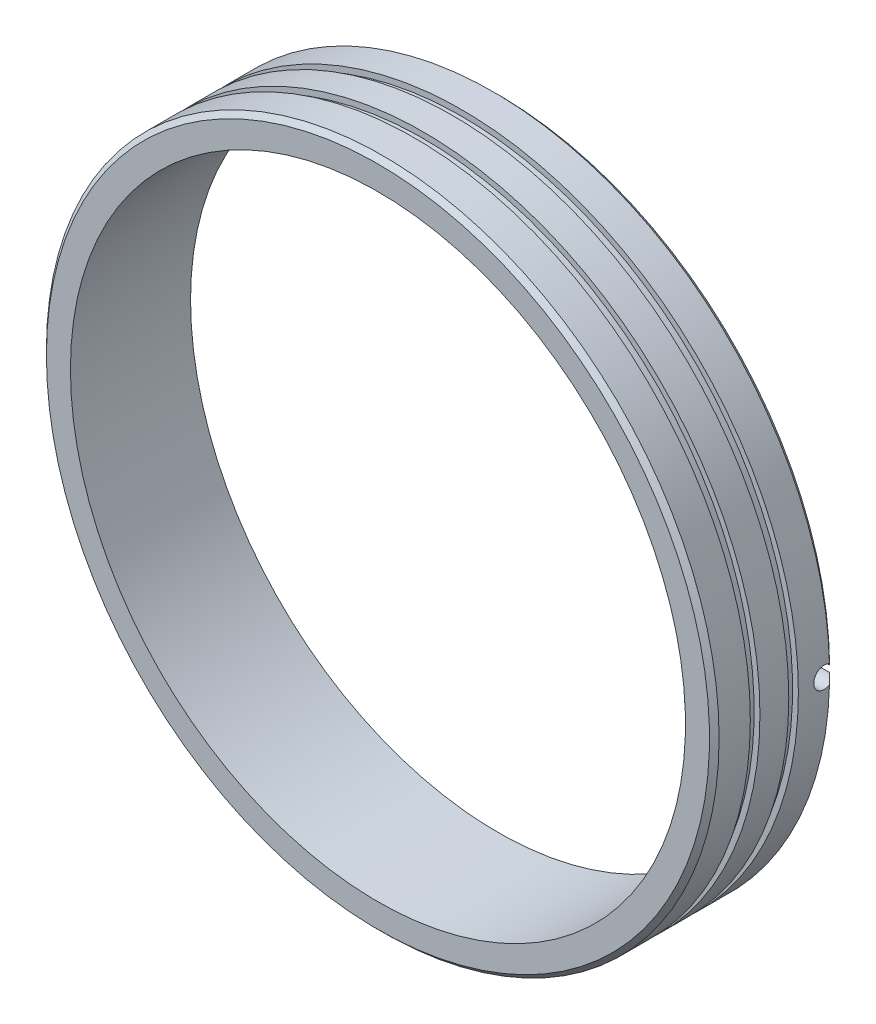
ISO-10303-21;
HEADER;
FILE_DESCRIPTION(('STEP AP214'),'2;1');
FILE_NAME('part.step','',(''),(''),'','','');
FILE_SCHEMA(('AUTOMOTIVE_DESIGN { 1 0 10303 214 1 1 1 1 }'));
ENDSEC;
DATA;
#1=APPLICATION_CONTEXT('core data for automotive mechanical design processes');
#2=APPLICATION_PROTOCOL_DEFINITION('international standard','automotive_design',2000,#1);
#3=PRODUCT_CONTEXT('',#1,'mechanical');
#4=PRODUCT('Part','Part','',(#3));
#5=PRODUCT_RELATED_PRODUCT_CATEGORY('part','',(#4));
#6=PRODUCT_DEFINITION_FORMATION('','',#4);
#7=PRODUCT_DEFINITION_CONTEXT('part definition',#1,'design');
#8=PRODUCT_DEFINITION('design','',#6,#7);
#9=PRODUCT_DEFINITION_SHAPE('','',#8);
#10=(LENGTH_UNIT() NAMED_UNIT(*) SI_UNIT(.MILLI.,.METRE.));
#11=(NAMED_UNIT(*) PLANE_ANGLE_UNIT() SI_UNIT($,.RADIAN.));
#12=(NAMED_UNIT(*) SI_UNIT($,.STERADIAN.) SOLID_ANGLE_UNIT());
#13=UNCERTAINTY_MEASURE_WITH_UNIT(LENGTH_MEASURE(1.E-05),#10,'distance_accuracy_value','');
#14=(GEOMETRIC_REPRESENTATION_CONTEXT(3) GLOBAL_UNCERTAINTY_ASSIGNED_CONTEXT((#13)) GLOBAL_UNIT_ASSIGNED_CONTEXT((#10,
#11,#12)) REPRESENTATION_CONTEXT('',''));
#15=CARTESIAN_POINT('',(0.,0.,0.));
#16=DIRECTION('',(0.,0.,1.));
#17=DIRECTION('',(1.,0.,0.));
#18=AXIS2_PLACEMENT_3D('',#15,#16,#17);
#19=CARTESIAN_POINT('',(0.,69.,1.5));
#20=DIRECTION('',(0.,0.,-1.));
#21=DIRECTION('',(-1.,0.,0.));
#22=AXIS2_PLACEMENT_3D('',#19,#20,#21);
#23=PLANE('',#22);
#24=CARTESIAN_POINT('',(0.,0.,1.5));
#25=DIRECTION('',(0.,0.,-1.));
#26=DIRECTION('',(-1.,0.,0.));
#27=AXIS2_PLACEMENT_3D('',#24,#25,#26);
#28=CIRCLE('',#27,64.);
#29=CARTESIAN_POINT('',(63.9966405368282,-0.6557438524302,1.5));
#30=VERTEX_POINT('',#29);
#31=CARTESIAN_POINT('',(63.9966405368282,0.6557438524302,1.5));
#32=VERTEX_POINT('',#31);
#33=EDGE_CURVE('E85',#30,#32,#28,.T.);
#34=ORIENTED_EDGE('',*,*,#33,.F.);
#35=DIRECTION('',(-1.,0.,0.));
#36=VECTOR('',#35,1.);
#37=CARTESIAN_POINT('',(71.,-0.6557438524302,1.5));
#38=LINE('',#37,#36);
#39=CARTESIAN_POINT('',(68.9968839876118,-0.655743852430738,1.49999999999975));
#40=VERTEX_POINT('',#39);
#41=EDGE_CURVE('E80',#30,#40,#38,.F.);
#42=ORIENTED_EDGE('',*,*,#41,.T.);
#43=CARTESIAN_POINT('',(0.,0.,1.5));
#44=DIRECTION('',(0.,0.,-1.));
#45=DIRECTION('',(-1.,0.,0.));
#46=AXIS2_PLACEMENT_3D('',#43,#44,#45);
#47=CIRCLE('',#46,69.);
#48=CARTESIAN_POINT('',(68.9968839876121,0.655743852430198,1.5));
#49=VERTEX_POINT('',#48);
#50=EDGE_CURVE('E88',#40,#49,#47,.T.);
#51=ORIENTED_EDGE('',*,*,#50,.T.);
#52=DIRECTION('',(-1.,0.,0.));
#53=VECTOR('',#52,1.);
#54=CARTESIAN_POINT('',(71.,0.6557438524302,1.5));
#55=LINE('',#54,#53);
#56=EDGE_CURVE('E93',#49,#32,#55,.T.);
#57=ORIENTED_EDGE('',*,*,#56,.T.);
#58=EDGE_LOOP('',(#34,#42,#51,#57));
#59=FACE_BOUND('',#58,.T.);
#60=ADVANCED_FACE('F39',(#59),#23,.T.);
#61=CARTESIAN_POINT('',(0.,0.,0.));
#62=DIRECTION('',(0.,0.,-1.));
#63=DIRECTION('',(-1.,0.,0.));
#64=AXIS2_PLACEMENT_3D('',#61,#62,#63);
#65=CYLINDRICAL_SURFACE('',#64,64.);
#66=CARTESIAN_POINT('',(0.,0.,26.5));
#67=DIRECTION('',(0.,0.,-1.));
#68=DIRECTION('',(-1.,0.,0.));
#69=AXIS2_PLACEMENT_3D('',#66,#67,#68);
#70=CIRCLE('',#69,64.);
#71=CARTESIAN_POINT('',(-64.,0.,26.5));
#72=VERTEX_POINT('',#71);
#73=EDGE_CURVE('E130',#72,#72,#70,.T.);
#74=ORIENTED_EDGE('',*,*,#73,.F.);
#75=EDGE_LOOP('',(#74));
#76=FACE_BOUND('',#75,.T.);
#77=ORIENTED_EDGE('',*,*,#33,.T.);
#78=CARTESIAN_POINT('',(63.9966405368282,0.6557438524302,1.5));
#79=CARTESIAN_POINT('',(63.9960355313497,0.714828654834886,1.51845018495424));
#80=CARTESIAN_POINT('',(63.9953560748767,0.773105499854566,1.53938567097289));
#81=CARTESIAN_POINT('',(63.9938691506616,0.887685326368586,1.58608689248524));
#82=CARTESIAN_POINT('',(63.9930616894037,0.943988407668942,1.61185238332384));
#83=CARTESIAN_POINT('',(63.9904812899459,1.10923205527596,1.69609632823883));
#84=CARTESIAN_POINT('',(63.9885482601087,1.21469890325343,1.76158238212781));
#85=CARTESIAN_POINT('',(63.9844742794105,1.41313330973744,1.90932454984776));
#86=CARTESIAN_POINT('',(63.9823332348744,1.5060951915261,1.99158823765328));
#87=CARTESIAN_POINT('',(63.9780849528549,1.67688727662046,2.17054695107996));
#88=CARTESIAN_POINT('',(63.9759777089866,1.75472036939317,2.26723921472038));
#89=CARTESIAN_POINT('',(63.9720338675274,1.8930643864804,2.47234082581569));
#90=CARTESIAN_POINT('',(63.9701973283563,1.95357157440688,2.58075269370823));
#91=CARTESIAN_POINT('',(63.9670023706672,2.05553470734067,2.8062203286565));
#92=CARTESIAN_POINT('',(63.9656440228184,2.09698783672947,2.92327737024526));
#93=CARTESIAN_POINT('',(63.9635596832414,2.15963513532369,3.16264863046549));
#94=CARTESIAN_POINT('',(63.9628334430369,2.18083726534706,3.28496076350595));
#95=CARTESIAN_POINT('',(63.9620944518421,2.20240618216054,3.53140284618538));
#96=CARTESIAN_POINT('',(63.9620816542719,2.20277432917951,3.65553267661949));
#97=CARTESIAN_POINT('',(63.9627707210345,2.18267259888069,3.90203583997396));
#98=CARTESIAN_POINT('',(63.9634722694707,2.16221193243951,4.02440992505853));
#99=CARTESIAN_POINT('',(63.9655104083833,2.10104867772378,4.26398750687467));
#100=CARTESIAN_POINT('',(63.9668470126341,2.06034565039322,4.38119089139392));
#101=CARTESIAN_POINT('',(63.9700047720249,1.95984780594549,4.60711684887966));
#102=CARTESIAN_POINT('',(63.9718259945064,1.90005033527691,4.71583824049048));
#103=CARTESIAN_POINT('',(63.9757476455198,1.76306304626749,4.92170157537921));
#104=CARTESIAN_POINT('',(63.9778480733861,1.68587326939073,5.01884354626214));
#105=CARTESIAN_POINT('',(63.9820927161592,1.51624370512112,5.1988454512589));
#106=CARTESIAN_POINT('',(63.9842369536498,1.42379586910501,5.28169780017573));
#107=CARTESIAN_POINT('',(63.9883264884012,1.22629961568631,5.43070791692029));
#108=CARTESIAN_POINT('',(63.990271785248,1.12125117206314,5.49686565000734));
#109=CARTESIAN_POINT('',(63.9937443448129,0.901522967033532,5.61061240908629));
#110=CARTESIAN_POINT('',(63.9952715720986,0.786842390356656,5.65819986134811));
#111=CARTESIAN_POINT('',(63.9977355606016,0.55111318843179,5.73344359548238));
#112=CARTESIAN_POINT('',(63.998672324006,0.43006458677256,5.76109995117902));
#113=CARTESIAN_POINT('',(63.9998494410775,0.185098775239764,5.79568487730061));
#114=CARTESIAN_POINT('',(64.0000901349399,0.0611829965229306,5.80262357327118));
#115=CARTESIAN_POINT('',(63.9998489554343,-0.186054372436356,5.7956041538341));
#116=CARTESIAN_POINT('',(63.9993670835317,-0.309375963883269,5.78164608080358));
#117=CARTESIAN_POINT('',(63.9977353359767,-0.551886021138484,5.73323836660406));
#118=CARTESIAN_POINT('',(63.9965856609167,-0.671075716684326,5.69879487870093));
#119=CARTESIAN_POINT('',(63.9937479288967,-0.901981043676224,5.61040120188278));
#120=CARTESIAN_POINT('',(63.992059870409,-1.01369665391055,5.55645095760965));
#121=CARTESIAN_POINT('',(63.9883347189916,-1.22652671762213,5.43055303599796));
#122=CARTESIAN_POINT('',(63.9862975015592,-1.32763736878587,5.35859893462987));
#123=CARTESIAN_POINT('',(63.9821038728376,-1.51634745727385,5.19874381062899));
#124=CARTESIAN_POINT('',(63.9799474613571,-1.6039468728909,5.11084276237627));
#125=CARTESIAN_POINT('',(63.9757573624067,-1.76318886416964,4.92154085064414));
#126=CARTESIAN_POINT('',(63.9737237312891,-1.83482415281145,4.82013385581476));
#127=CARTESIAN_POINT('',(63.9700096236547,-1.9600533441064,4.60672599235404));
#128=CARTESIAN_POINT('',(63.9683291486147,-2.01364717131596,4.49472507942486));
#129=CARTESIAN_POINT('',(63.9655112582438,-2.10126215317601,4.26332538560151));
#130=CARTESIAN_POINT('',(63.9643737614297,-2.13528624475072,4.14392771775465));
#131=CARTESIAN_POINT('',(63.9627699295431,-2.18280443175172,3.90111246443361));
#132=CARTESIAN_POINT('',(63.9623035810744,-2.19629893695256,3.77769495924639));
#133=CARTESIAN_POINT('',(63.9620947455558,-2.20237276809453,3.53041255926403));
#134=CARTESIAN_POINT('',(63.9623518685864,-2.19496336032387,3.40654794138193));
#135=CARTESIAN_POINT('',(63.9635601393379,-2.15946392368036,3.1618168566723));
#136=CARTESIAN_POINT('',(63.9645113155343,-2.1313730462846,3.04095051306881));
#137=CARTESIAN_POINT('',(63.9670003044048,-2.05531235373944,2.8056591658348));
#138=CARTESIAN_POINT('',(63.9685380797028,-2.00734380510944,2.69123375234352));
#139=CARTESIAN_POINT('',(63.9720268426248,-1.89289302862836,2.47206483583606));
#140=CARTESIAN_POINT('',(63.9739778050034,-1.82641193179862,2.36732074186168));
#141=CARTESIAN_POINT('',(63.9780742797743,-1.67678193587367,2.17041842692611));
#142=CARTESIAN_POINT('',(63.9802199058013,-1.59362326652538,2.07826763698152));
#143=CARTESIAN_POINT('',(63.984463354104,-1.41300912507469,1.90923152053194));
#144=CARTESIAN_POINT('',(63.9865611821814,-1.31555539891382,1.83234433248618));
#145=CARTESIAN_POINT('',(63.9901451122917,-1.12636121819089,1.70740054798216));
#146=CARTESIAN_POINT('',(63.9916749164999,-1.03636919697133,1.65667537890616));
#147=CARTESIAN_POINT('',(63.9944208792047,-0.850237007978545,1.56831305202433));
#148=CARTESIAN_POINT('',(63.9956372236896,-0.754100528419748,1.53066812854233));
#149=CARTESIAN_POINT('',(63.9966405368282,-0.6557438524302,1.5));
#150=B_SPLINE_CURVE_WITH_KNOTS('',3,(#78,#79,#80,#81,#82,#83,#84,#85,#86,#87,#88,#89,#90,#91,
#92,#93,#94,#95,#96,#97,#98,#99,#100,#101,#102,#103,#104,#105,#106,#107,#108,#109,#110,#111,
#112,#113,#114,#115,#116,#117,#118,#119,#120,#121,#122,#123,#124,#125,#126,#127,#128,#129,#130,
#131,#132,#133,#134,#135,#136,#137,#138,#139,#140,#141,#142,#143,#144,#145,#146,#147,#148,#149),
.UNSPECIFIED.,.F.,.F.,(4,2,2,2,2,2,2,2,2,2,2,2,2,2,2,2,2,2,2,2,2,2,2,2,2,2,2,2,2,2,2,2,2,2,2,4),
(0.,0.185590145572976,0.371170892953936,0.741736802217008,1.1124703688512,1.48313305887637,
1.85387562342532,2.22467295501,2.59532446335023,2.96595177221512,3.33641525417352,
3.70688677182065,4.07740979625187,4.44793193734843,4.81865015717222,5.18936914843607,
5.56011954929452,5.93086857689734,6.30143637499674,6.67200342161232,7.04245921606074,
7.41291606183155,7.78350528078906,8.15409509513027,8.5248537247815,8.89561390480639,
9.26631842854274,9.63701555284749,10.007512925905,10.3780255006401,10.7485144715425,
11.1189808124417,11.4896648216464,11.8603035946154,12.1692579587007,12.4780285834581),.UNSPECIFIED.);
#151=EDGE_CURVE('E66',#32,#30,#150,.T.);
#152=ORIENTED_EDGE('',*,*,#151,.T.);
#153=EDGE_LOOP('',(#77,#152));
#154=FACE_BOUND('',#153,.T.);
#155=ADVANCED_FACE('F128',(#76,#154),#65,.F.);
#156=CARTESIAN_POINT('',(0.,0.,0.));
#157=DIRECTION('',(0.,0.,-1.));
#158=DIRECTION('',(-1.,0.,0.));
#159=AXIS2_PLACEMENT_3D('',#156,#157,#158);
#160=CYLINDRICAL_SURFACE('',#159,70.);
#161=CARTESIAN_POINT('',(0.,0.,9.));
#162=DIRECTION('',(0.,0.,-1.));
#163=DIRECTION('',(-1.,0.,0.));
#164=AXIS2_PLACEMENT_3D('',#161,#162,#163);
#165=CIRCLE('',#164,70.);
#166=CARTESIAN_POINT('',(-70.,0.,9.));
#167=VERTEX_POINT('',#166);
#168=EDGE_CURVE('E91',#167,#167,#165,.T.);
#169=ORIENTED_EDGE('',*,*,#168,.T.);
#170=EDGE_LOOP('',(#169));
#171=FACE_BOUND('',#170,.T.);
#172=CARTESIAN_POINT('',(0.,0.,2.5));
#173=DIRECTION('',(0.,0.,-1.));
#174=DIRECTION('',(-1.,0.,0.));
#175=AXIS2_PLACEMENT_3D('',#172,#173,#174);
#176=CIRCLE('',#175,70.);
#177=CARTESIAN_POINT('',(69.9740666247146,-1.90525588832576,2.5));
#178=VERTEX_POINT('',#177);
#179=CARTESIAN_POINT('',(69.9740666247146,1.90525588832576,2.5));
#180=VERTEX_POINT('',#179);
#181=EDGE_CURVE('E89',#178,#180,#176,.T.);
#182=ORIENTED_EDGE('',*,*,#181,.F.);
#183=CARTESIAN_POINT('',(69.9740666247146,-1.90525588832576,2.5));
#184=CARTESIAN_POINT('',(69.9732240670352,-1.93619147154011,2.5535828453595));
#185=CARTESIAN_POINT('',(69.9724234680632,-1.96485144766761,2.60844599512067));
#186=CARTESIAN_POINT('',(69.9709267186213,-2.01745172178715,2.72038820084514));
#187=CARTESIAN_POINT('',(69.9702305633965,-2.041392234658,2.77746715578037));
#188=CARTESIAN_POINT('',(69.9683314600662,-2.10581752036295,2.9513338843076));
#189=CARTESIAN_POINT('',(69.9673150675001,-2.1390053747467,3.0709239635534));
#190=CARTESIAN_POINT('',(69.9658989503347,-2.18483720361173,3.31397764900739));
#191=CARTESIAN_POINT('',(69.9654995194271,-2.19747139410649,3.437443071476));
#192=CARTESIAN_POINT('',(69.9653621825678,-2.20184033373677,3.6847345308456));
#193=CARTESIAN_POINT('',(69.9656241431159,-2.19357930052182,3.80856048993379));
#194=CARTESIAN_POINT('',(69.9667799445191,-2.15639613125671,4.05303889201555));
#195=CARTESIAN_POINT('',(69.9676736646514,-2.1274779425634,4.17369193675213));
#196=CARTESIAN_POINT('',(69.9699921602677,-2.04980388563898,4.40845007035623));
#197=CARTESIAN_POINT('',(69.9714170181293,-2.00104494006763,4.52255414033092));
#198=CARTESIAN_POINT('',(69.9746374691385,-1.88506280946007,4.74097840357205));
#199=CARTESIAN_POINT('',(69.9764331322853,-1.81783613736034,4.84529674410856));
#200=CARTESIAN_POINT('',(69.9801925306842,-1.66683501731169,5.0411631837251));
#201=CARTESIAN_POINT('',(69.9821562557943,-1.58306156750244,5.13271205252096));
#202=CARTESIAN_POINT('',(69.9860315414428,-1.4012984548046,5.30048996098643));
#203=CARTESIAN_POINT('',(69.9879430787835,-1.30330258837981,5.37671228073201));
#204=CARTESIAN_POINT('',(69.99149767059,-1.09589884095454,5.51162508202171));
#205=CARTESIAN_POINT('',(69.9931407195817,-0.986490727344539,5.57031520612255));
#206=CARTESIAN_POINT('',(69.9959729767911,-0.759374818925392,5.66849074296763));
#207=CARTESIAN_POINT('',(69.9971622116357,-0.641667511537006,5.70797728248552));
#208=CARTESIAN_POINT('',(69.9989528721081,-0.401290522449355,5.76662662189507));
#209=CARTESIAN_POINT('',(69.9995543027728,-0.278620883280885,5.78578959593616));
#210=CARTESIAN_POINT('',(70.0001014212551,-0.0318580350653546,5.80324251195878));
#211=CARTESIAN_POINT('',(70.0000473946718,0.0922345304312912,5.80154154487459));
#212=CARTESIAN_POINT('',(69.9992903827967,0.33837186817898,5.77733709348432));
#213=CARTESIAN_POINT('',(69.9985873979867,0.460416641949877,5.75483362461837));
#214=CARTESIAN_POINT('',(69.9966118303431,0.698976741604183,5.68966952445137));
#215=CARTESIAN_POINT('',(69.9953393289577,0.815492855522066,5.64701177542093));
#216=CARTESIAN_POINT('',(69.9923680541706,1.03971107398455,5.54275242562459));
#217=CARTESIAN_POINT('',(69.9906692785408,1.14741313245678,5.48115072584388));
#218=CARTESIAN_POINT('',(69.9870360309875,1.35098961596164,5.34072499108136));
#219=CARTESIAN_POINT('',(69.9851014707539,1.4468595822119,5.26189449445235));
#220=CARTESIAN_POINT('',(69.9812151076381,1.62400731282431,5.08926029593335));
#221=CARTESIAN_POINT('',(69.9792633047549,1.70528507613123,4.99545659296058));
#222=CARTESIAN_POINT('',(69.9755617937697,1.85096739709604,4.7955023701022));
#223=CARTESIAN_POINT('',(69.9738121509112,1.9153665159432,4.68934788629185));
#224=CARTESIAN_POINT('',(69.9707131302158,2.02542577345658,4.46773058220294));
#225=CARTESIAN_POINT('',(69.9693637408508,2.07108645183998,4.35226803013626));
#226=CARTESIAN_POINT('',(69.9672178225558,2.14236110821234,4.1153516524148));
#227=CARTESIAN_POINT('',(69.9664211071923,2.16798184664566,3.99389986193159));
#228=CARTESIAN_POINT('',(69.9654697276821,2.19847293728253,3.74838476716308));
#229=CARTESIAN_POINT('',(69.9653152029535,2.2033387836559,3.62432090167773));
#230=CARTESIAN_POINT('',(69.9656656928765,2.19218001742135,3.37714831801686));
#231=CARTESIAN_POINT('',(69.966170748342,2.17615411205907,3.25403965942251));
#232=CARTESIAN_POINT('',(69.9677838335928,2.12365463811376,3.01234115240335));
#233=CARTESIAN_POINT('',(69.9688911573044,2.08720501192268,2.89374618617808));
#234=CARTESIAN_POINT('',(69.9707990193374,2.02179284597267,2.73106082445937));
#235=CARTESIAN_POINT('',(69.9714049122828,2.00075219789189,2.68365810490321));
#236=CARTESIAN_POINT('',(69.9726864468109,1.95541940105803,2.59054172148917));
#237=CARTESIAN_POINT('',(69.9733619590754,1.93113325678721,2.54482513279628));
#238=CARTESIAN_POINT('',(69.9740666247146,1.90525588832579,2.49999999999999));
#239=B_SPLINE_CURVE_WITH_KNOTS('',3,(#183,#184,#185,#186,#187,#188,#189,#190,#191,#192,#193,
#194,#195,#196,#197,#198,#199,#200,#201,#202,#203,#204,#205,#206,#207,#208,#209,#210,#211,#212,
#213,#214,#215,#216,#217,#218,#219,#220,#221,#222,#223,#224,#225,#226,#227,#228,#229,#230,#231,
#232,#233,#234,#235,#236,#237,#238),.UNSPECIFIED.,.F.,.F.,(4,2,2,2,2,2,2,2,2,2,2,2,2,2,2,2,2,2,
2,2,2,2,2,2,2,2,2,4),(0.,0.185518986256829,0.371029523817737,0.741461117793825,1.11206899364233,
1.48260206917227,1.8530643588117,2.22358412979243,2.59417391020795,2.96474134261936,
3.33547089769921,3.70620801063124,4.07692336787367,4.44763554848861,4.81818620639363,
5.18873658926709,5.55923399563447,5.92973333852271,6.30037187609424,6.67101044046848,
7.04176828939298,7.41251545875076,7.78313750308731,8.15384000435986,8.52456544530866,
8.89485719742772,9.05035049552023,9.20555999895483),.UNSPECIFIED.);
#240=EDGE_CURVE('E56',#178,#180,#239,.T.);
#241=ORIENTED_EDGE('',*,*,#240,.T.);
#242=EDGE_LOOP('',(#182,#241));
#243=FACE_BOUND('',#242,.T.);
#244=ADVANCED_FACE('F149',(#171,#243),#160,.T.);
#245=CARTESIAN_POINT('',(0.,0.,1.5));
#246=DIRECTION('',(0.,0.,1.));
#247=DIRECTION('',(1.,0.,0.));
#248=AXIS2_PLACEMENT_3D('',#245,#246,#247);
#249=CONICAL_SURFACE('',#248,69.,0.785398163397449);
#250=ORIENTED_EDGE('',*,*,#181,.T.);
#251=CARTESIAN_POINT('',(70.0728024277608,1.95969384343575,2.6002));
#252=CARTESIAN_POINT('',(70.0115857522608,1.92800831329282,2.53812297280018));
#253=CARTESIAN_POINT('',(69.9512162556786,1.8930254908531,2.47681688604438));
#254=CARTESIAN_POINT('',(69.8325926396518,1.8160656096565,2.35619275663205));
#255=CARTESIAN_POINT('',(69.7743450268482,1.77406893610997,2.29688086594672));
#256=CARTESIAN_POINT('',(69.6600676562041,1.68231780317074,2.18036476788102));
#257=CARTESIAN_POINT('',(69.6040723903511,1.6324772528,2.12319389566767));
#258=CARTESIAN_POINT('',(69.495928061262,1.52519636968136,2.01264271137508));
#259=CARTESIAN_POINT('',(69.4437741473528,1.46776588654565,1.95925762207653));
#260=CARTESIAN_POINT('',(69.3323859089416,1.33045448587439,1.84510984762356));
#261=CARTESIAN_POINT('',(69.2744049872334,1.24847917702755,1.78559931915772));
#262=CARTESIAN_POINT('',(69.1682950046268,1.0728463047413,1.67656061128673));
#263=CARTESIAN_POINT('',(69.1201244978169,0.979240696012855,1.62699045120905));
#264=CARTESIAN_POINT('',(69.0428022244901,0.796810880401315,1.54735026915838));
#265=CARTESIAN_POINT('',(69.0118483849246,0.709565638879,1.51543705793652));
#266=CARTESIAN_POINT('',(68.9604580259563,0.528806687127913,1.46242675487145));
#267=CARTESIAN_POINT('',(68.9400220138472,0.435292674790843,1.44133018473452));
#268=CARTESIAN_POINT('',(68.911054687592,0.243986559676033,1.41142012503725));
#269=CARTESIAN_POINT('',(68.902583014955,0.146175512863556,1.40266817292194));
#270=CARTESIAN_POINT('',(68.8984347865371,-0.0499937282418294,1.39838319482375));
#271=CARTESIAN_POINT('',(68.9027542546654,-0.148351743024197,1.40284606105092));
#272=CARTESIAN_POINT('',(68.9228825827799,-0.333716026385589,1.42363358756962));
#273=CARTESIAN_POINT('',(68.9376525304523,-0.420962270340464,1.43888563559556));
#274=CARTESIAN_POINT('',(68.9765829039504,-0.590981507480196,1.47906231049844));
#275=CARTESIAN_POINT('',(69.0007447933199,-0.673753801199711,1.50398844488462));
#276=CARTESIAN_POINT('',(69.0590002328235,-0.83847205570709,1.5640382521904));
#277=CARTESIAN_POINT('',(69.093632476268,-0.920022687928886,1.59971455421976));
#278=CARTESIAN_POINT('',(69.1704609752408,-1.07541559673432,1.67877730876864));
#279=CARTESIAN_POINT('',(69.2126617067643,-1.14925327076966,1.72216832362852));
#280=CARTESIAN_POINT('',(69.3278603672649,-1.32698202902267,1.84047653921418));
#281=CARTESIAN_POINT('',(69.4050975613627,-1.42528566889714,1.91967636608866));
#282=CARTESIAN_POINT('',(69.5698104670831,-1.60299459160588,2.08822104502074));
#283=CARTESIAN_POINT('',(69.6573131644879,-1.68234832046089,2.17759261713178));
#284=CARTESIAN_POINT('',(69.8005162176453,-1.79306900591675,2.32353223436744));
#285=CARTESIAN_POINT('',(69.8539195690272,-1.83049349485155,2.37789110542168));
#286=CARTESIAN_POINT('',(69.962249014836,-1.89938964995566,2.48801977132214));
#287=CARTESIAN_POINT('',(70.0171633502554,-1.93089744865931,2.54377847579336));
#288=CARTESIAN_POINT('',(70.0728024277608,-1.95969384343575,2.6002));
#289=B_SPLINE_CURVE_WITH_KNOTS('',3,(#251,#252,#253,#254,#255,#256,#257,#258,#259,#260,#261,
#262,#263,#264,#265,#266,#267,#268,#269,#270,#271,#272,#273,#274,#275,#276,#277,#278,#279,#280,
#281,#282,#283,#284,#285,#286,#287,#288),.UNSPECIFIED.,.F.,.F.,(4,2,2,2,2,2,2,2,2,2,2,2,2,2,2,2,
2,2,4),(0.,0.278299712050051,0.557391159715929,0.839792255238057,1.12183040710716,
1.47074399639638,1.81815147536893,2.11070141657319,2.40326546666646,2.69728284418477,
2.991208836805,3.25940383324364,3.52764063919905,3.81312446700275,4.09877768972331,
4.54030950653224,4.98302918174421,5.23751165821446,5.49038554915614),.UNSPECIFIED.);
#290=EDGE_CURVE('E11',#180,#49,#289,.T.);
#291=ORIENTED_EDGE('',*,*,#290,.T.);
#292=ORIENTED_EDGE('',*,*,#50,.F.);
#293=EDGE_CURVE('E45',#40,#178,#289,.T.);
#294=ORIENTED_EDGE('',*,*,#293,.T.);
#295=EDGE_LOOP('',(#250,#291,#292,#294));
#296=FACE_BOUND('',#295,.T.);
#297=ADVANCED_FACE('F90',(#296),#249,.T.);
#298=CARTESIAN_POINT('',(0.,64.,26.5));
#299=DIRECTION('',(0.,0.,1.));
#300=DIRECTION('',(1.,0.,0.));
#301=AXIS2_PLACEMENT_3D('',#298,#299,#300);
#302=PLANE('',#301);
#303=ORIENTED_EDGE('',*,*,#73,.T.);
#304=EDGE_LOOP('',(#303));
#305=FACE_BOUND('',#304,.T.);
#306=CARTESIAN_POINT('',(0.,0.,26.5));
#307=DIRECTION('',(0.,0.,-1.));
#308=DIRECTION('',(-1.,0.,0.));
#309=AXIS2_PLACEMENT_3D('',#306,#307,#308);
#310=CIRCLE('',#309,69.);
#311=CARTESIAN_POINT('',(-69.,0.,26.5));
#312=VERTEX_POINT('',#311);
#313=EDGE_CURVE('E123',#312,#312,#310,.T.);
#314=ORIENTED_EDGE('',*,*,#313,.F.);
#315=EDGE_LOOP('',(#314));
#316=FACE_BOUND('',#315,.T.);
#317=ADVANCED_FACE('F190',(#305,#316),#302,.T.);
#318=CARTESIAN_POINT('',(0.,0.,25.5));
#319=DIRECTION('',(0.,0.,-1.));
#320=DIRECTION('',(-1.,0.,0.));
#321=AXIS2_PLACEMENT_3D('',#318,#319,#320);
#322=CONICAL_SURFACE('',#321,70.,0.78539816339745);
#323=ORIENTED_EDGE('',*,*,#313,.T.);
#324=EDGE_LOOP('',(#323));
#325=FACE_BOUND('',#324,.T.);
#326=CARTESIAN_POINT('',(0.,0.,25.5));
#327=DIRECTION('',(0.,0.,-1.));
#328=DIRECTION('',(-1.,0.,0.));
#329=AXIS2_PLACEMENT_3D('',#326,#327,#328);
#330=CIRCLE('',#329,70.);
#331=CARTESIAN_POINT('',(-70.,0.,25.5));
#332=VERTEX_POINT('',#331);
#333=EDGE_CURVE('E121',#332,#332,#330,.T.);
#334=ORIENTED_EDGE('',*,*,#333,.F.);
#335=EDGE_LOOP('',(#334));
#336=FACE_BOUND('',#335,.T.);
#337=ADVANCED_FACE('F184',(#325,#336),#322,.T.);
#338=CARTESIAN_POINT('',(0.,0.,0.));
#339=DIRECTION('',(0.,0.,-1.));
#340=DIRECTION('',(-1.,0.,0.));
#341=AXIS2_PLACEMENT_3D('',#338,#339,#340);
#342=CYLINDRICAL_SURFACE('',#341,70.);
#343=ORIENTED_EDGE('',*,*,#333,.T.);
#344=EDGE_LOOP('',(#343));
#345=FACE_BOUND('',#344,.T.);
#346=CARTESIAN_POINT('',(0.,0.,19.));
#347=DIRECTION('',(0.,0.,-1.));
#348=DIRECTION('',(-1.,0.,0.));
#349=AXIS2_PLACEMENT_3D('',#346,#347,#348);
#350=CIRCLE('',#349,70.);
#351=CARTESIAN_POINT('',(-70.,0.,19.));
#352=VERTEX_POINT('',#351);
#353=EDGE_CURVE('E119',#352,#352,#350,.T.);
#354=ORIENTED_EDGE('',*,*,#353,.F.);
#355=EDGE_LOOP('',(#354));
#356=FACE_BOUND('',#355,.T.);
#357=ADVANCED_FACE('F179',(#345,#356),#342,.T.);
#358=CARTESIAN_POINT('',(0.,70.,19.));
#359=DIRECTION('',(0.,0.,-1.));
#360=DIRECTION('',(-1.,0.,0.));
#361=AXIS2_PLACEMENT_3D('',#358,#359,#360);
#362=PLANE('',#361);
#363=ORIENTED_EDGE('',*,*,#353,.T.);
#364=EDGE_LOOP('',(#363));
#365=FACE_BOUND('',#364,.T.);
#366=CARTESIAN_POINT('',(0.,0.,19.));
#367=DIRECTION('',(0.,0.,-1.));
#368=DIRECTION('',(-1.,0.,0.));
#369=AXIS2_PLACEMENT_3D('',#366,#367,#368);
#370=CIRCLE('',#369,68.8);
#371=CARTESIAN_POINT('',(-68.8,0.,19.));
#372=VERTEX_POINT('',#371);
#373=EDGE_CURVE('E113',#372,#372,#370,.T.);
#374=ORIENTED_EDGE('',*,*,#373,.F.);
#375=EDGE_LOOP('',(#374));
#376=FACE_BOUND('',#375,.T.);
#377=ADVANCED_FACE('F176',(#365,#376),#362,.T.);
#378=CARTESIAN_POINT('',(0.,0.,0.));
#379=DIRECTION('',(0.,0.,-1.));
#380=DIRECTION('',(-1.,0.,0.));
#381=AXIS2_PLACEMENT_3D('',#378,#379,#380);
#382=CYLINDRICAL_SURFACE('',#381,68.8);
#383=ORIENTED_EDGE('',*,*,#373,.T.);
#384=EDGE_LOOP('',(#383));
#385=FACE_BOUND('',#384,.T.);
#386=CARTESIAN_POINT('',(0.,0.,17.));
#387=DIRECTION('',(0.,0.,-1.));
#388=DIRECTION('',(-1.,0.,0.));
#389=AXIS2_PLACEMENT_3D('',#386,#387,#388);
#390=CIRCLE('',#389,68.8);
#391=CARTESIAN_POINT('',(-68.8,0.,17.));
#392=VERTEX_POINT('',#391);
#393=EDGE_CURVE('E115',#392,#392,#390,.T.);
#394=ORIENTED_EDGE('',*,*,#393,.F.);
#395=EDGE_LOOP('',(#394));
#396=FACE_BOUND('',#395,.T.);
#397=ADVANCED_FACE('F175',(#385,#396),#382,.T.);
#398=CARTESIAN_POINT('',(0.,68.8,17.));
#399=DIRECTION('',(0.,0.,1.));
#400=DIRECTION('',(1.,0.,0.));
#401=AXIS2_PLACEMENT_3D('',#398,#399,#400);
#402=PLANE('',#401);
#403=ORIENTED_EDGE('',*,*,#393,.T.);
#404=EDGE_LOOP('',(#403));
#405=FACE_BOUND('',#404,.T.);
#406=CARTESIAN_POINT('',(0.,0.,17.));
#407=DIRECTION('',(0.,0.,-1.));
#408=DIRECTION('',(-1.,0.,0.));
#409=AXIS2_PLACEMENT_3D('',#406,#407,#408);
#410=CIRCLE('',#409,70.);
#411=CARTESIAN_POINT('',(-70.,0.,17.));
#412=VERTEX_POINT('',#411);
#413=EDGE_CURVE('E108',#412,#412,#410,.T.);
#414=ORIENTED_EDGE('',*,*,#413,.F.);
#415=EDGE_LOOP('',(#414));
#416=FACE_BOUND('',#415,.T.);
#417=ADVANCED_FACE('F169',(#405,#416),#402,.T.);
#418=CARTESIAN_POINT('',(0.,0.,0.));
#419=DIRECTION('',(0.,0.,-1.));
#420=DIRECTION('',(-1.,0.,0.));
#421=AXIS2_PLACEMENT_3D('',#418,#419,#420);
#422=CYLINDRICAL_SURFACE('',#421,70.);
#423=ORIENTED_EDGE('',*,*,#413,.T.);
#424=EDGE_LOOP('',(#423));
#425=FACE_BOUND('',#424,.T.);
#426=CARTESIAN_POINT('',(0.,0.,11.));
#427=DIRECTION('',(0.,0.,-1.));
#428=DIRECTION('',(-1.,0.,0.));
#429=AXIS2_PLACEMENT_3D('',#426,#427,#428);
#430=CIRCLE('',#429,70.);
#431=CARTESIAN_POINT('',(-70.,0.,11.));
#432=VERTEX_POINT('',#431);
#433=EDGE_CURVE('E106',#432,#432,#430,.T.);
#434=ORIENTED_EDGE('',*,*,#433,.F.);
#435=EDGE_LOOP('',(#434));
#436=FACE_BOUND('',#435,.T.);
#437=ADVANCED_FACE('F163',(#425,#436),#422,.T.);
#438=CARTESIAN_POINT('',(0.,70.,11.));
#439=DIRECTION('',(0.,0.,-1.));
#440=DIRECTION('',(-1.,0.,0.));
#441=AXIS2_PLACEMENT_3D('',#438,#439,#440);
#442=PLANE('',#441);
#443=ORIENTED_EDGE('',*,*,#433,.T.);
#444=EDGE_LOOP('',(#443));
#445=FACE_BOUND('',#444,.T.);
#446=CARTESIAN_POINT('',(0.,0.,11.));
#447=DIRECTION('',(0.,0.,-1.));
#448=DIRECTION('',(-1.,0.,0.));
#449=AXIS2_PLACEMENT_3D('',#446,#447,#448);
#450=CIRCLE('',#449,68.8);
#451=CARTESIAN_POINT('',(-68.8,0.,11.));
#452=VERTEX_POINT('',#451);
#453=EDGE_CURVE('E103',#452,#452,#450,.T.);
#454=ORIENTED_EDGE('',*,*,#453,.F.);
#455=EDGE_LOOP('',(#454));
#456=FACE_BOUND('',#455,.T.);
#457=ADVANCED_FACE('F159',(#445,#456),#442,.T.);
#458=CARTESIAN_POINT('',(0.,0.,0.));
#459=DIRECTION('',(0.,0.,-1.));
#460=DIRECTION('',(-1.,0.,0.));
#461=AXIS2_PLACEMENT_3D('',#458,#459,#460);
#462=CYLINDRICAL_SURFACE('',#461,68.8);
#463=ORIENTED_EDGE('',*,*,#453,.T.);
#464=EDGE_LOOP('',(#463));
#465=FACE_BOUND('',#464,.T.);
#466=CARTESIAN_POINT('',(0.,0.,9.));
#467=DIRECTION('',(0.,0.,-1.));
#468=DIRECTION('',(-1.,0.,0.));
#469=AXIS2_PLACEMENT_3D('',#466,#467,#468);
#470=CIRCLE('',#469,68.8);
#471=CARTESIAN_POINT('',(-68.8,0.,9.));
#472=VERTEX_POINT('',#471);
#473=EDGE_CURVE('E99',#472,#472,#470,.T.);
#474=ORIENTED_EDGE('',*,*,#473,.F.);
#475=EDGE_LOOP('',(#474));
#476=FACE_BOUND('',#475,.T.);
#477=ADVANCED_FACE('F156',(#465,#476),#462,.T.);
#478=CARTESIAN_POINT('',(0.,68.8,9.));
#479=DIRECTION('',(0.,0.,1.));
#480=DIRECTION('',(1.,0.,0.));
#481=AXIS2_PLACEMENT_3D('',#478,#479,#480);
#482=PLANE('',#481);
#483=ORIENTED_EDGE('',*,*,#473,.T.);
#484=EDGE_LOOP('',(#483));
#485=FACE_BOUND('',#484,.T.);
#486=ORIENTED_EDGE('',*,*,#168,.F.);
#487=EDGE_LOOP('',(#486));
#488=FACE_BOUND('',#487,.T.);
#489=ADVANCED_FACE('F139',(#485,#488),#482,.T.);
#490=CARTESIAN_POINT('',(71.,0.,3.6));
#491=DIRECTION('',(-1.,0.,0.));
#492=DIRECTION('',(0.,0.,1.));
#493=AXIS2_PLACEMENT_3D('',#490,#491,#492);
#494=CYLINDRICAL_SURFACE('',#493,2.2);
#495=ORIENTED_EDGE('',*,*,#290,.F.);
#496=ORIENTED_EDGE('',*,*,#240,.F.);
#497=ORIENTED_EDGE('',*,*,#293,.F.);
#498=ORIENTED_EDGE('',*,*,#41,.F.);
#499=ORIENTED_EDGE('',*,*,#151,.F.);
#500=ORIENTED_EDGE('',*,*,#56,.F.);
#501=EDGE_LOOP('',(#495,#496,#497,#498,#499,#500));
#502=FACE_BOUND('',#501,.T.);
#503=ADVANCED_FACE('F77',(#502),#494,.F.);
#504=CLOSED_SHELL('',(#60,#155,#244,#297,#317,#337,#357,#377,#397,#417,#437,#457,#477,#489,#503));
#505=MANIFOLD_SOLID_BREP('B2',#504);
#506=ADVANCED_BREP_SHAPE_REPRESENTATION('',(#18,#505),#14);
#507=SHAPE_DEFINITION_REPRESENTATION(#9,#506);
ENDSEC;
END-ISO-10303-21;
